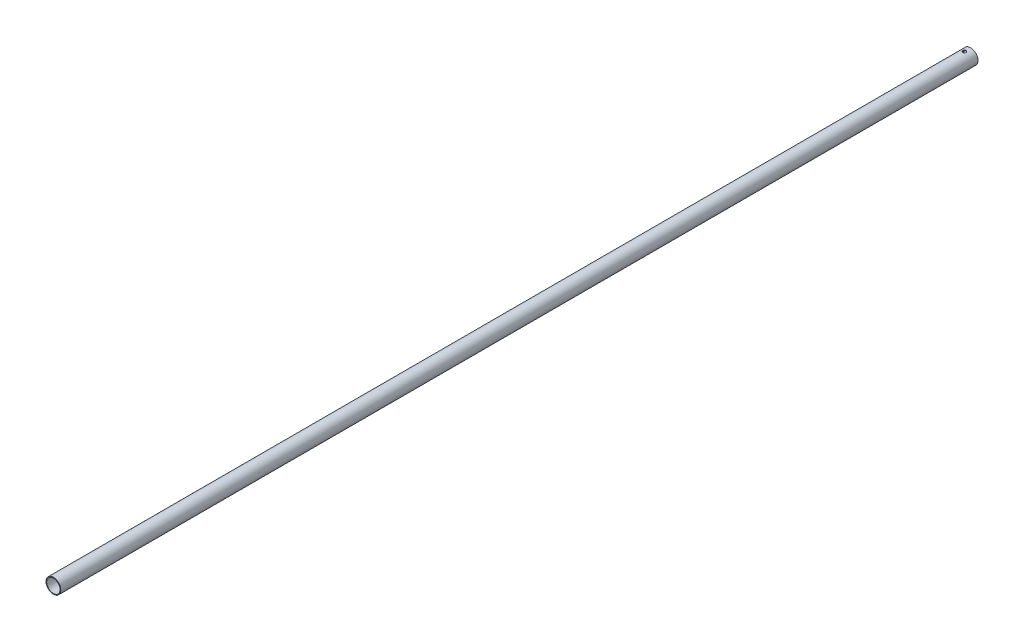
ISO-10303-21;
HEADER;
FILE_DESCRIPTION(('STEP AP214'),'2;1');
FILE_NAME('part.step','',(''),(''),'','','');
FILE_SCHEMA(('AUTOMOTIVE_DESIGN { 1 0 10303 214 1 1 1 1 }'));
ENDSEC;
DATA;
#1=APPLICATION_CONTEXT('core data for automotive mechanical design processes');
#2=APPLICATION_PROTOCOL_DEFINITION('international standard','automotive_design',2000,#1);
#3=PRODUCT_CONTEXT('',#1,'mechanical');
#4=PRODUCT('Part','Part','',(#3));
#5=PRODUCT_RELATED_PRODUCT_CATEGORY('part','',(#4));
#6=PRODUCT_DEFINITION_FORMATION('','',#4);
#7=PRODUCT_DEFINITION_CONTEXT('part definition',#1,'design');
#8=PRODUCT_DEFINITION('design','',#6,#7);
#9=PRODUCT_DEFINITION_SHAPE('','',#8);
#10=(LENGTH_UNIT() NAMED_UNIT(*) SI_UNIT(.MILLI.,.METRE.));
#11=(NAMED_UNIT(*) PLANE_ANGLE_UNIT() SI_UNIT($,.RADIAN.));
#12=(NAMED_UNIT(*) SI_UNIT($,.STERADIAN.) SOLID_ANGLE_UNIT());
#13=UNCERTAINTY_MEASURE_WITH_UNIT(LENGTH_MEASURE(1.E-05),#10,'distance_accuracy_value','');
#14=(GEOMETRIC_REPRESENTATION_CONTEXT(3) GLOBAL_UNCERTAINTY_ASSIGNED_CONTEXT((#13)) GLOBAL_UNIT_ASSIGNED_CONTEXT((#10,
#11,#12)) REPRESENTATION_CONTEXT('',''));
#15=CARTESIAN_POINT('',(0.,0.,0.));
#16=DIRECTION('',(0.,0.,1.));
#17=DIRECTION('',(1.,0.,0.));
#18=AXIS2_PLACEMENT_3D('',#15,#16,#17);
#19=CARTESIAN_POINT('',(0.,0.,1828.8));
#20=DIRECTION('',(0.,0.,1.));
#21=DIRECTION('',(1.,0.,0.));
#22=AXIS2_PLACEMENT_3D('',#19,#20,#21);
#23=PLANE('',#22);
#24=CARTESIAN_POINT('',(0.,0.,1828.8));
#25=DIRECTION('',(0.,0.,1.));
#26=DIRECTION('',(1.,0.,0.));
#27=AXIS2_PLACEMENT_3D('',#24,#25,#26);
#28=CIRCLE('',#27,14.732);
#29=CARTESIAN_POINT('',(14.732,0.,1828.8));
#30=VERTEX_POINT('',#29);
#31=EDGE_CURVE('E49',#30,#30,#28,.T.);
#32=ORIENTED_EDGE('',*,*,#31,.T.);
#33=EDGE_LOOP('',(#32));
#34=FACE_BOUND('',#33,.T.);
#35=CARTESIAN_POINT('',(0.,0.,1828.8));
#36=DIRECTION('',(0.,0.,1.));
#37=DIRECTION('',(1.,0.,0.));
#38=AXIS2_PLACEMENT_3D('',#35,#36,#37);
#39=CIRCLE('',#38,13.3096);
#40=CARTESIAN_POINT('',(13.3096,0.,1828.8));
#41=VERTEX_POINT('',#40);
#42=EDGE_CURVE('E82',#41,#41,#39,.T.);
#43=ORIENTED_EDGE('',*,*,#42,.F.);
#44=EDGE_LOOP('',(#43));
#45=FACE_BOUND('',#44,.T.);
#46=ADVANCED_FACE('F34',(#34,#45),#23,.T.);
#47=CARTESIAN_POINT('',(0.,0.,0.));
#48=DIRECTION('',(0.,0.,1.));
#49=DIRECTION('',(1.,0.,0.));
#50=AXIS2_PLACEMENT_3D('',#47,#48,#49);
#51=PLANE('',#50);
#52=CARTESIAN_POINT('',(0.,0.,0.));
#53=DIRECTION('',(0.,0.,1.));
#54=DIRECTION('',(1.,0.,0.));
#55=AXIS2_PLACEMENT_3D('',#52,#53,#54);
#56=CIRCLE('',#55,14.732);
#57=CARTESIAN_POINT('',(14.732,0.,0.));
#58=VERTEX_POINT('',#57);
#59=EDGE_CURVE('E53',#58,#58,#56,.T.);
#60=ORIENTED_EDGE('',*,*,#59,.F.);
#61=EDGE_LOOP('',(#60));
#62=FACE_BOUND('',#61,.T.);
#63=CARTESIAN_POINT('',(0.,0.,0.));
#64=DIRECTION('',(0.,0.,1.));
#65=DIRECTION('',(1.,0.,0.));
#66=AXIS2_PLACEMENT_3D('',#63,#64,#65);
#67=CIRCLE('',#66,13.3096);
#68=CARTESIAN_POINT('',(13.3096,0.,0.));
#69=VERTEX_POINT('',#68);
#70=EDGE_CURVE('E81',#69,#69,#67,.T.);
#71=ORIENTED_EDGE('',*,*,#70,.T.);
#72=EDGE_LOOP('',(#71));
#73=FACE_BOUND('',#72,.T.);
#74=ADVANCED_FACE('F88',(#62,#73),#51,.F.);
#75=CARTESIAN_POINT('',(0.,0.,1828.8));
#76=DIRECTION('',(0.,0.,-1.));
#77=DIRECTION('',(-1.,0.,0.));
#78=AXIS2_PLACEMENT_3D('',#75,#76,#77);
#79=CYLINDRICAL_SURFACE('',#78,14.732);
#80=CARTESIAN_POINT('',(0.,14.732,9.32179999999983));
#81=CARTESIAN_POINT('',(0.187131447611956,14.7319966001457,9.32180605386422));
#82=CARTESIAN_POINT('',(0.374334152603728,14.7283984719449,9.33740133979259));
#83=CARTESIAN_POINT('',(0.74340655187048,14.7143926969545,9.39929642108672));
#84=CARTESIAN_POINT('',(0.925272607182175,14.703980511571,9.44561668151146));
#85=CARTESIAN_POINT('',(1.2782858791483,14.6775038961328,9.56742230359938));
#86=CARTESIAN_POINT('',(1.44944460488663,14.6614456622814,9.64287570224491));
#87=CARTESIAN_POINT('',(1.77666995391303,14.625402595161,9.82070064260563));
#88=CARTESIAN_POINT('',(1.93273666954159,14.605417785919,9.92307201960888));
#89=CARTESIAN_POINT('',(2.22808819406893,14.5633127111008,10.1537253827067));
#90=CARTESIAN_POINT('',(2.36707054201526,14.5411638090381,10.2823894719563));
#91=CARTESIAN_POINT('',(2.62168345581226,14.4974248200542,10.5611563682776));
#92=CARTESIAN_POINT('',(2.73731177036403,14.475834787182,10.7112612398344));
#93=CARTESIAN_POINT('',(2.94329725387856,14.4353737605774,11.0309214825308));
#94=CARTESIAN_POINT('',(3.03332713324862,14.4165393572966,11.2006928028813));
#95=CARTESIAN_POINT('',(3.18345903659266,14.3841353876776,11.5534593780235));
#96=CARTESIAN_POINT('',(3.24356502308592,14.3705651243149,11.7364528782583));
#97=CARTESIAN_POINT('',(3.33113283599908,14.3505184897756,12.1071732117394));
#98=CARTESIAN_POINT('',(3.35913295020314,14.3439252908497,12.2947664397369));
#99=CARTESIAN_POINT('',(3.38336893369784,14.3382288183229,12.6720946584787));
#100=CARTESIAN_POINT('',(3.37960911052193,14.3391245290169,12.8618293552942));
#101=CARTESIAN_POINT('',(3.34086392025864,14.3481991400425,13.2340135034387));
#102=CARTESIAN_POINT('',(3.3065089932605,14.3562309860178,13.4165327191287));
#103=CARTESIAN_POINT('',(3.20854984189074,14.3784397870969,13.7731458372927));
#104=CARTESIAN_POINT('',(3.14494383155281,14.3926171174189,13.9472392245982));
#105=CARTESIAN_POINT('',(2.98972284628259,14.4256611213651,14.2838044607512));
#106=CARTESIAN_POINT('',(2.89786990869746,14.4445673703978,14.4461625155299));
#107=CARTESIAN_POINT('',(2.68892944508801,14.4849153243439,14.7533919246306));
#108=CARTESIAN_POINT('',(2.57183815869783,14.5063574068666,14.8982606681245));
#109=CARTESIAN_POINT('',(2.3124307323858,14.5499882192732,15.1700235633726));
#110=CARTESIAN_POINT('',(2.16957978037689,14.5721825627183,15.2964068654781));
#111=CARTESIAN_POINT('',(1.86445410983722,14.6143531443339,15.5235111719661));
#112=CARTESIAN_POINT('',(1.7021789685437,14.6343293342085,15.6242316176533));
#113=CARTESIAN_POINT('',(1.36215374790074,14.6698881267572,15.7972969385889));
#114=CARTESIAN_POINT('',(1.1843657152706,14.6854595347365,15.869569693503));
#115=CARTESIAN_POINT('',(0.818730701060208,14.710371815422,15.9830689691913));
#116=CARTESIAN_POINT('',(0.630885335955561,14.719713686149,16.0243004631565));
#117=CARTESIAN_POINT('',(0.254845122038752,14.7309704241799,16.0737917810848));
#118=CARTESIAN_POINT('',(0.0667465926267801,14.7330422904383,16.0827487049661));
#119=CARTESIAN_POINT('',(-0.308259557960982,14.7299678661712,16.0693333774968));
#120=CARTESIAN_POINT('',(-0.495167267322549,14.7248221165348,16.0469634737824));
#121=CARTESIAN_POINT('',(-0.860139860318962,14.7079902344294,15.9721065927819));
#122=CARTESIAN_POINT('',(-1.03828475722023,14.6963845829445,15.9199900164671));
#123=CARTESIAN_POINT('',(-1.38330138843616,14.6679341823493,15.7875341809285));
#124=CARTESIAN_POINT('',(-1.55017209778978,14.651088957676,15.7071923597915));
#125=CARTESIAN_POINT('',(-1.87075093692221,14.6136438889812,15.5191473753149));
#126=CARTESIAN_POINT('',(-2.02421602130011,14.5929900833801,15.4110408592847));
#127=CARTESIAN_POINT('',(-2.3110762731522,14.5503202423161,15.1710611933966));
#128=CARTESIAN_POINT('',(-2.44446855202962,14.5283040114342,15.0391846288766));
#129=CARTESIAN_POINT('',(-2.69019126896926,14.4848408073507,14.7521959890129));
#130=CARTESIAN_POINT('',(-2.80203676703047,14.4634145963205,14.5966649487097));
#131=CARTESIAN_POINT('',(-2.99802691636467,14.4240663823163,14.2686203539915));
#132=CARTESIAN_POINT('',(-3.08217279664048,14.4061442238855,14.0961075534805));
#133=CARTESIAN_POINT('',(-3.21978182721179,14.3760145501504,13.7399364161649));
#134=CARTESIAN_POINT('',(-3.27342273793599,14.3637740050762,13.5563496929139));
#135=CARTESIAN_POINT('',(-3.34900594314382,14.3463415355122,13.1824480248074));
#136=CARTESIAN_POINT('',(-3.37095389252946,14.3411483535876,12.9921342864475));
#137=CARTESIAN_POINT('',(-3.382269202787,14.3384833423039,12.6150841971379));
#138=CARTESIAN_POINT('',(-3.37240728776097,14.3408288523656,12.4283718624401));
#139=CARTESIAN_POINT('',(-3.32211909851957,14.3525608492553,12.0593466988277));
#140=CARTESIAN_POINT('',(-3.28169326113024,14.3619472354536,11.8770338070736));
#141=CARTESIAN_POINT('',(-3.17181349558821,14.3866100650401,11.5226682050254));
#142=CARTESIAN_POINT('',(-3.10248228756408,14.4018615865159,11.3505755915067));
#143=CARTESIAN_POINT('',(-2.93686157962824,14.4365437383777,11.0203541524321));
#144=CARTESIAN_POINT('',(-2.84056895671188,14.4559748528353,10.8622269473153));
#145=CARTESIAN_POINT('',(-2.62124813718453,14.4973644101571,10.560649516865));
#146=CARTESIAN_POINT('',(-2.49767526985933,14.5193692793152,10.4176016983001));
#147=CARTESIAN_POINT('',(-2.22839211689635,14.5631268831364,10.1540209326553));
#148=CARTESIAN_POINT('',(-2.08267668691363,14.5848795579402,10.0334932321833));
#149=CARTESIAN_POINT('',(-1.77068379206408,14.6260586910409,9.81668140400447));
#150=CARTESIAN_POINT('',(-1.60413764725286,14.6454466341934,9.72077613267112));
#151=CARTESIAN_POINT('',(-1.25687158331251,14.679319731042,9.55847495718051));
#152=CARTESIAN_POINT('',(-1.07616313751671,14.6938088039145,9.49205545054899));
#153=CARTESIAN_POINT('',(-0.746188060283068,14.713808009638,9.401816242836));
#154=CARTESIAN_POINT('',(-0.598643048765121,14.7205862935473,9.37186978491507));
#155=CARTESIAN_POINT('',(-0.300747267464762,14.7296835364517,9.33185975912476));
#156=CARTESIAN_POINT('',(-0.15039664722894,14.7320027324466,9.32179513453805));
#157=CARTESIAN_POINT('',(0.,14.732,9.32179999999983));
#158=B_SPLINE_CURVE_WITH_KNOTS('',3,(#80,#81,#82,#83,#84,#85,#86,#87,#88,#89,#90,#91,#92,#93,
#94,#95,#96,#97,#98,#99,#100,#101,#102,#103,#104,#105,#106,#107,#108,#109,#110,#111,#112,#113,
#114,#115,#116,#117,#118,#119,#120,#121,#122,#123,#124,#125,#126,#127,#128,#129,#130,#131,#132,
#133,#134,#135,#136,#137,#138,#139,#140,#141,#142,#143,#144,#145,#146,#147,#148,#149,#150,#151,
#152,#153,#154,#155,#156,#157),.UNSPECIFIED.,.T.,.F.,(4,2,2,2,2,2,2,2,2,2,2,2,2,2,2,2,2,2,2,2,2,
2,2,2,2,2,2,2,2,2,2,2,2,2,2,2,2,2,4),(0.,0.560843630008992,1.12206119812677,1.68266477583236,
2.24326492326711,2.81267983536493,3.38214961216036,3.9586028214096,4.53497967645816,
5.10154479461211,5.66803307196556,6.22311168726183,6.77822419816973,7.33814759775088,
7.89815448037143,8.47151192411654,9.04488184911732,9.61969615578617,10.1944183505402,
10.7566500855535,11.318839689108,11.8741771224607,12.4295649750063,12.9935290549488,
13.5575742152423,14.1331209150034,14.7086420749212,15.2807742225907,15.8528042734209,
16.4110796199459,16.9693469876327,17.5252679398519,18.0812533123722,18.6495468598641,
19.2179726404898,19.7946812306918,20.3709273468026,20.8216986423222,21.2724459787505),.UNSPECIFIED.);
#159=CARTESIAN_POINT('',(0.,14.732,9.32179999999983));
#160=VERTEX_POINT('',#159);
#161=EDGE_CURVE('E10',#160,#160,#158,.T.);
#162=ORIENTED_EDGE('',*,*,#161,.T.);
#163=EDGE_LOOP('',(#162));
#164=FACE_BOUND('',#163,.T.);
#165=CARTESIAN_POINT('',(0.,-14.7319999999864,9.32179999999983));
#166=CARTESIAN_POINT('',(-0.187131447612173,-14.7319966001307,9.32180605386422));
#167=CARTESIAN_POINT('',(-0.374334152604161,-14.7283984719409,9.33740133979263));
#168=CARTESIAN_POINT('',(-0.743406551871034,-14.7143926969585,9.39929642108684));
#169=CARTESIAN_POINT('',(-0.925272607182637,-14.7039805115721,9.44561668151159));
#170=CARTESIAN_POINT('',(-1.2782858791487,-14.6775038961317,9.56742230359955));
#171=CARTESIAN_POINT('',(-1.44944460488704,-14.6614456622811,9.6428757022451));
#172=CARTESIAN_POINT('',(-1.77666995391354,-14.6254025951613,9.82070064260594));
#173=CARTESIAN_POINT('',(-1.93273666954217,-14.605417785919,9.92307201960928));
#174=CARTESIAN_POINT('',(-2.22808819406957,-14.5633127111007,10.1537253827073));
#175=CARTESIAN_POINT('',(-2.36707054201588,-14.541163809038,10.2823894719569));
#176=CARTESIAN_POINT('',(-2.62168345581281,-14.4974248200541,10.5611563682783));
#177=CARTESIAN_POINT('',(-2.73731177036453,-14.4758347871819,10.7112612398351));
#178=CARTESIAN_POINT('',(-2.94329725387897,-14.4353737605773,11.0309214825315));
#179=CARTESIAN_POINT('',(-3.033327133249,-14.4165393572966,11.2006928028821));
#180=CARTESIAN_POINT('',(-3.18345903659295,-14.3841353876775,11.5534593780243));
#181=CARTESIAN_POINT('',(-3.24356502308616,-14.3705651243149,11.7364528782591));
#182=CARTESIAN_POINT('',(-3.33113283599923,-14.3505184897756,12.1071732117402));
#183=CARTESIAN_POINT('',(-3.35913295020325,-14.3439252908496,12.2947664397377));
#184=CARTESIAN_POINT('',(-3.38336893369785,-14.3382288183229,12.6720946584795));
#185=CARTESIAN_POINT('',(-3.37960911052189,-14.3391245290169,12.861829355295));
#186=CARTESIAN_POINT('',(-3.34086392025852,-14.3481991400425,13.2340135034395));
#187=CARTESIAN_POINT('',(-3.30650899326033,-14.3562309860178,13.4165327191295));
#188=CARTESIAN_POINT('',(-3.20854984189049,-14.378439787097,13.7731458372934));
#189=CARTESIAN_POINT('',(-3.14494383155251,-14.392617117419,13.947239224599));
#190=CARTESIAN_POINT('',(-2.98972284628221,-14.4256611213652,14.2838044607519));
#191=CARTESIAN_POINT('',(-2.89786990869704,-14.4445673703979,14.4461625155306));
#192=CARTESIAN_POINT('',(-2.68892944508752,-14.484915324344,14.7533919246313));
#193=CARTESIAN_POINT('',(-2.5718381586973,-14.5063574068667,14.8982606681251));
#194=CARTESIAN_POINT('',(-2.3124307323852,-14.5499882192733,15.1700235633731));
#195=CARTESIAN_POINT('',(-2.16957978037625,-14.5721825627184,15.2964068654787));
#196=CARTESIAN_POINT('',(-1.86445410983653,-14.614353144334,15.5235111719665));
#197=CARTESIAN_POINT('',(-1.70217896854298,-14.6343293342086,15.6242316176537));
#198=CARTESIAN_POINT('',(-1.36215374789997,-14.6698881267573,15.7972969385893));
#199=CARTESIAN_POINT('',(-1.18436571526982,-14.6854595347366,15.8695696935033));
#200=CARTESIAN_POINT('',(-0.818730701059401,-14.7103718154221,15.9830689691915));
#201=CARTESIAN_POINT('',(-0.630885335954746,-14.7197136861491,16.0243004631566));
#202=CARTESIAN_POINT('',(-0.254845122037929,-14.7309704241799,16.0737917810848));
#203=CARTESIAN_POINT('',(-0.0667465926259573,-14.7330422904383,16.0827487049661));
#204=CARTESIAN_POINT('',(0.308259557961795,-14.7299678661712,16.0693333774967));
#205=CARTESIAN_POINT('',(0.495167267323354,-14.7248221165348,16.0469634737823));
#206=CARTESIAN_POINT('',(0.860139860319743,-14.7079902344294,15.9721065927817));
#207=CARTESIAN_POINT('',(1.038284757221,-14.6963845829444,15.9199900164668));
#208=CARTESIAN_POINT('',(1.38330138843689,-14.6679341823493,15.7875341809281));
#209=CARTESIAN_POINT('',(1.5501720977905,-14.651088957676,15.7071923597911));
#210=CARTESIAN_POINT('',(1.87075093692289,-14.6136438889811,15.5191473753144));
#211=CARTESIAN_POINT('',(2.02421602130076,-14.59299008338,15.4110408592842));
#212=CARTESIAN_POINT('',(2.3110762731528,-14.550320242316,15.1710611933961));
#213=CARTESIAN_POINT('',(2.44446855203019,-14.5283040114341,15.039184628876));
#214=CARTESIAN_POINT('',(2.69019126896976,-14.4848408073506,14.7521959890122));
#215=CARTESIAN_POINT('',(2.80203676703094,-14.4634145963204,14.596664948709));
#216=CARTESIAN_POINT('',(2.99802691636505,-14.4240663823162,14.2686203539907));
#217=CARTESIAN_POINT('',(3.08217279664083,-14.4061442238854,14.0961075534798));
#218=CARTESIAN_POINT('',(3.21978182721204,-14.3760145501504,13.7399364161641));
#219=CARTESIAN_POINT('',(3.2734227379362,-14.3637740050762,13.5563496929131));
#220=CARTESIAN_POINT('',(3.34900594314393,-14.3463415355122,13.1824480248065));
#221=CARTESIAN_POINT('',(3.37095389252953,-14.3411483535876,12.9921342864466));
#222=CARTESIAN_POINT('',(3.38226920278697,-14.3384833423039,12.6150841971371));
#223=CARTESIAN_POINT('',(3.3724072877609,-14.3408288523656,12.4283718624393));
#224=CARTESIAN_POINT('',(3.32211909851941,-14.3525608492553,12.0593466988269));
#225=CARTESIAN_POINT('',(3.28169326113004,-14.3619472354537,11.8770338070728));
#226=CARTESIAN_POINT('',(3.17181349558792,-14.3866100650402,11.5226682050246));
#227=CARTESIAN_POINT('',(3.10248228756375,-14.401861586516,11.350575591506));
#228=CARTESIAN_POINT('',(2.93686157962783,-14.4365437383778,11.0203541524314));
#229=CARTESIAN_POINT('',(2.84056895671144,-14.4559748528354,10.8622269473147));
#230=CARTESIAN_POINT('',(2.62124813718402,-14.4973644101572,10.5606495168644));
#231=CARTESIAN_POINT('',(2.4976752698588,-14.5193692793153,10.4176016982995));
#232=CARTESIAN_POINT('',(2.22839211689575,-14.5631268831364,10.1540209326548));
#233=CARTESIAN_POINT('',(2.08267668691299,-14.5848795579402,10.0334932321828));
#234=CARTESIAN_POINT('',(1.77068379206332,-14.6260586910411,9.816681404004));
#235=CARTESIAN_POINT('',(1.60413764725203,-14.6454466341938,9.72077613267067));
#236=CARTESIAN_POINT('',(1.25687158331163,-14.6793197310417,9.55847495718016));
#237=CARTESIAN_POINT('',(1.07616313751585,-14.6938088039133,9.49205545054871));
#238=CARTESIAN_POINT('',(0.746188060282481,-14.713808009639,9.40181624283588));
#239=CARTESIAN_POINT('',(0.598643048764779,-14.7205862935507,9.37186978491501));
#240=CARTESIAN_POINT('',(0.300747267464698,-14.7296835364484,9.33185975912476));
#241=CARTESIAN_POINT('',(0.150396647228908,-14.7320027324342,9.32179513453805));
#242=CARTESIAN_POINT('',(0.,-14.7319999999864,9.32179999999983));
#243=B_SPLINE_CURVE_WITH_KNOTS('',3,(#165,#166,#167,#168,#169,#170,#171,#172,#173,#174,#175,
#176,#177,#178,#179,#180,#181,#182,#183,#184,#185,#186,#187,#188,#189,#190,#191,#192,#193,#194,
#195,#196,#197,#198,#199,#200,#201,#202,#203,#204,#205,#206,#207,#208,#209,#210,#211,#212,#213,
#214,#215,#216,#217,#218,#219,#220,#221,#222,#223,#224,#225,#226,#227,#228,#229,#230,#231,#232,
#233,#234,#235,#236,#237,#238,#239,#240,#241,#242),.UNSPECIFIED.,.T.,.F.,(4,2,2,2,2,2,2,2,2,2,2,
2,2,2,2,2,2,2,2,2,2,2,2,2,2,2,2,2,2,2,2,2,2,2,2,2,2,2,4),(0.,0.560843630009313,1.12206119812693,
1.68266477583258,2.24326492326768,2.81267983536556,3.38214961216094,3.95860282141016,
4.53497967645873,5.10154479461267,5.66803307196612,6.22311168726238,6.77822419817028,
7.33814759775144,7.898154480372,8.47151192411711,9.0448818491179,9.61969615578674,
10.1944183505408,10.7566500855541,11.3188396891086,11.8741771224613,12.4295649750069,
12.9935290549493,13.5575742152429,14.1331209150039,14.7086420749218,15.2807742225913,
15.8528042734214,16.4110796199465,16.9693469876332,17.5252679398525,18.0812533123727,
18.6495468598646,19.2179726404903,19.7946812306925,20.3709273468032,20.8216986423221,
21.27244597875),.UNSPECIFIED.);
#244=CARTESIAN_POINT('',(0.,-14.7319999999864,9.32179999999983));
#245=VERTEX_POINT('',#244);
#246=EDGE_CURVE('E45',#245,#245,#243,.T.);
#247=ORIENTED_EDGE('',*,*,#246,.T.);
#248=EDGE_LOOP('',(#247));
#249=FACE_BOUND('',#248,.T.);
#250=ORIENTED_EDGE('',*,*,#31,.F.);
#251=EDGE_LOOP('',(#250));
#252=FACE_BOUND('',#251,.T.);
#253=ORIENTED_EDGE('',*,*,#59,.T.);
#254=EDGE_LOOP('',(#253));
#255=FACE_BOUND('',#254,.T.);
#256=ADVANCED_FACE('F36',(#164,#249,#252,#255),#79,.T.);
#257=CARTESIAN_POINT('',(0.,0.,1828.8));
#258=DIRECTION('',(0.,0.,-1.));
#259=DIRECTION('',(-1.,0.,0.));
#260=AXIS2_PLACEMENT_3D('',#257,#258,#259);
#261=CYLINDRICAL_SURFACE('',#260,13.3096);
#262=CARTESIAN_POINT('',(0.,13.3096,9.32179999999983));
#263=CARTESIAN_POINT('',(0.186554652962986,13.3095969109228,9.32180506427518));
#264=CARTESIAN_POINT('',(0.37316533638762,13.3056387503281,9.33730513504318));
#265=CARTESIAN_POINT('',(0.741032277003986,13.2902325907197,9.39879925689162));
#266=CARTESIAN_POINT('',(0.922285545424134,13.2787804904748,9.44481000582802));
#267=CARTESIAN_POINT('',(1.27407272645917,13.2496536695332,9.56574938071836));
#268=CARTESIAN_POINT('',(1.44461943097135,13.2319865477845,9.64064270340335));
#269=CARTESIAN_POINT('',(1.77072916191042,13.1923079947584,9.81709557336344));
#270=CARTESIAN_POINT('',(1.92629157036932,13.1702963844239,9.91865621978375));
#271=CARTESIAN_POINT('',(2.22131147855702,13.123794331151,10.147832532983));
#272=CARTESIAN_POINT('',(2.3604064239225,13.0992647065274,10.2759069880218));
#273=CARTESIAN_POINT('',(2.61539104407132,13.0507495996773,10.5534934321833));
#274=CARTESIAN_POINT('',(2.7312780194283,13.0267641810373,10.7030079116277));
#275=CARTESIAN_POINT('',(2.93827618766256,12.9816569072081,11.0220629524792));
#276=CARTESIAN_POINT('',(3.02897923918766,12.9605847262485,11.1918759725819));
#277=CARTESIAN_POINT('',(3.18040921321818,12.9242622644693,11.5449612437461));
#278=CARTESIAN_POINT('',(3.24114109068739,12.9090110214018,11.7282312642789));
#279=CARTESIAN_POINT('',(3.32966292928755,12.8864603488888,12.0990350318006));
#280=CARTESIAN_POINT('',(3.35810600561099,12.8790035157981,12.2864030633535));
#281=CARTESIAN_POINT('',(3.38327761840556,12.8724149979296,12.6633883206009));
#282=CARTESIAN_POINT('',(3.38001148389089,12.8732819142715,12.8530051630132));
#283=CARTESIAN_POINT('',(3.34237790087318,12.8831015874797,13.2240795067148));
#284=CARTESIAN_POINT('',(3.30879137830129,12.8918513050391,13.4056224235155));
#285=CARTESIAN_POINT('',(3.21271728473935,12.916126792158,13.7604086404818));
#286=CARTESIAN_POINT('',(3.15022759847522,12.9316530576535,13.9336513321723));
#287=CARTESIAN_POINT('',(2.99746209552305,12.9679168237261,14.2690002894341));
#288=CARTESIAN_POINT('',(2.90690502819104,12.9887066634958,14.4309725356815));
#289=CARTESIAN_POINT('',(2.70077193224505,13.0331258574421,14.7377009805581));
#290=CARTESIAN_POINT('',(2.58519140207062,13.0567557221802,14.882454074303));
#291=CARTESIAN_POINT('',(2.32825884587872,13.1050451991495,15.15510743275));
#292=CARTESIAN_POINT('',(2.18624852681347,13.1297146514802,15.2823864178681));
#293=CARTESIAN_POINT('',(1.88260203987316,13.1766774179335,15.5114430219632));
#294=CARTESIAN_POINT('',(1.72096523588841,13.1989706549971,15.6132198140665));
#295=CARTESIAN_POINT('',(1.38175070360576,13.2387857275834,15.7886211673993));
#296=CARTESIAN_POINT('',(1.20411726348216,13.2562899571325,15.8621422416022));
#297=CARTESIAN_POINT('',(0.838468380374663,13.2844269237831,15.9781050249451));
#298=CARTESIAN_POINT('',(0.650454994155326,13.2950610169211,16.0205528675804));
#299=CARTESIAN_POINT('',(0.274692882533026,13.3080578792961,16.0722094714894));
#300=CARTESIAN_POINT('',(0.0870675282143573,13.3106310568203,16.0822639763967));
#301=CARTESIAN_POINT('',(-0.287185694745769,13.3078167071077,16.0711717181669));
#302=CARTESIAN_POINT('',(-0.473813654510617,13.3024299200288,16.0500278560123));
#303=CARTESIAN_POINT('',(-0.837817665927995,13.284435989163,15.9778354591342));
#304=CARTESIAN_POINT('',(-1.01529172438224,13.2719408711519,15.9272506289178));
#305=CARTESIAN_POINT('',(-1.35922417805681,13.2411404827736,15.7981438402908));
#306=CARTESIAN_POINT('',(-1.52568143929171,13.2228346154125,15.7196190112368));
#307=CARTESIAN_POINT('',(-1.84620254911101,13.1819417790299,15.5352379889173));
#308=CARTESIAN_POINT('',(-1.99998627558639,13.1592830703432,15.4289111386913));
#309=CARTESIAN_POINT('',(-2.28782794464276,13.1123072483171,15.1925436563825));
#310=CARTESIAN_POINT('',(-2.4218823649277,13.0879898399794,15.0624987991536));
#311=CARTESIAN_POINT('',(-2.66996313138391,13.0396761431003,14.7784551846477));
#312=CARTESIAN_POINT('',(-2.78339538829273,13.0157036352544,14.6239326161434));
#313=CARTESIAN_POINT('',(-2.98272186504876,12.9714797534345,14.2975490012059));
#314=CARTESIAN_POINT('',(-3.06861729702366,12.951228215686,14.1256887183895));
#315=CARTESIAN_POINT('',(-3.20978913734648,12.9169650155754,13.7704192581572));
#316=CARTESIAN_POINT('',(-3.26524663307016,12.9029165486771,13.5870857752571));
#317=CARTESIAN_POINT('',(-3.34443597580053,12.8826201809599,13.2132844536662));
#318=CARTESIAN_POINT('',(-3.3681750173691,12.8763705111942,13.0228182429416));
#319=CARTESIAN_POINT('',(-3.38286901331672,12.8725171097274,12.6462115918051));
#320=CARTESIAN_POINT('',(-3.37477464777319,12.874662651686,12.4601102247462));
#321=CARTESIAN_POINT('',(-3.32821397897427,12.8867765959605,12.0920192487436));
#322=CARTESIAN_POINT('',(-3.28974832287096,12.8967448315903,11.9100295522733));
#323=CARTESIAN_POINT('',(-3.1840635233641,12.923239083001,11.5563980084024));
#324=CARTESIAN_POINT('',(-3.11702787328046,12.9397232017683,11.3846979670713));
#325=CARTESIAN_POINT('',(-2.95625039630482,12.9773966174536,11.054857467728));
#326=CARTESIAN_POINT('',(-2.86250475342327,12.9985865865892,10.8967189514198));
#327=CARTESIAN_POINT('',(-2.64801020321307,13.0439947024499,10.5939089807236));
#328=CARTESIAN_POINT('',(-2.52660406678114,13.0682788600394,10.449712897488));
#329=CARTESIAN_POINT('',(-2.26150868943288,13.1167509252733,10.1834309900639));
#330=CARTESIAN_POINT('',(-2.11781413891375,13.1409388085712,10.0613504493584));
#331=CARTESIAN_POINT('',(-1.80895577724954,13.1870366928881,9.84051973726624));
#332=CARTESIAN_POINT('',(-1.64343869987078,13.2088952351058,9.74225207517397));
#333=CARTESIAN_POINT('',(-1.2976918965115,13.2473244422275,9.57509292571126));
#334=CARTESIAN_POINT('',(-1.11747257547268,13.2638988067239,9.50618087428918));
#335=CARTESIAN_POINT('',(-0.78137484603621,13.2875099960353,9.40964282505157));
#336=CARTESIAN_POINT('',(-0.627064863007049,13.2957360818809,9.37677413274459));
#337=CARTESIAN_POINT('',(-0.315183076251307,13.3067821722657,9.33285145458799));
#338=CARTESIAN_POINT('',(-0.157611534811808,13.3096026098207,9.3217957214241));
#339=CARTESIAN_POINT('',(0.,13.3096,9.32179999999983));
#340=B_SPLINE_CURVE_WITH_KNOTS('',3,(#262,#263,#264,#265,#266,#267,#268,#269,#270,#271,#272,
#273,#274,#275,#276,#277,#278,#279,#280,#281,#282,#283,#284,#285,#286,#287,#288,#289,#290,#291,
#292,#293,#294,#295,#296,#297,#298,#299,#300,#301,#302,#303,#304,#305,#306,#307,#308,#309,#310,
#311,#312,#313,#314,#315,#316,#317,#318,#319,#320,#321,#322,#323,#324,#325,#326,#327,#328,#329,
#330,#331,#332,#333,#334,#335,#336,#337,#338,#339),.UNSPECIFIED.,.T.,.F.,(4,2,2,2,2,2,2,2,2,2,2,
2,2,2,2,2,2,2,2,2,2,2,2,2,2,2,2,2,2,2,2,2,2,2,2,2,2,2,4),(0.,0.559086278806051,1.1184787866414,
1.67718970319196,2.23592365170692,2.8052837730679,3.37471008092363,3.95288768335552,
4.53096966692348,5.09713777006698,5.66321072528513,6.21510738218008,6.76704443594863,
7.32470150201794,7.88245897049595,8.45662962699911,9.03081889779087,9.60709154801935,
10.1832504180209,10.7442392778874,11.3051759774487,11.8575080668609,12.4098969210059,
12.9723220252578,13.5348474184318,14.111637678425,14.6884025455316,15.2616977496149,
15.8348628935004,16.3910427985697,16.9472108528662,17.4998594576539,18.052587057584,
18.6201497278497,19.1878478125856,19.7662338731313,20.344214096495,20.8165984869331,
21.288945035761),.UNSPECIFIED.);
#341=CARTESIAN_POINT('',(0.,13.3096,9.32179999999983));
#342=VERTEX_POINT('',#341);
#343=EDGE_CURVE('E76',#342,#342,#340,.T.);
#344=ORIENTED_EDGE('',*,*,#343,.F.);
#345=EDGE_LOOP('',(#344));
#346=FACE_BOUND('',#345,.T.);
#347=CARTESIAN_POINT('',(0.,-13.3096,9.32179999999983));
#348=CARTESIAN_POINT('',(-0.18655465296299,-13.3095969109228,9.32180506427518));
#349=CARTESIAN_POINT('',(-0.373165336387623,-13.3056387503281,9.33730513504318));
#350=CARTESIAN_POINT('',(-0.741032277003989,-13.2902325907197,9.39879925689162));
#351=CARTESIAN_POINT('',(-0.922285545424138,-13.2787804904748,9.44481000582802));
#352=CARTESIAN_POINT('',(-1.27407272645917,-13.2496536695332,9.56574938071836));
#353=CARTESIAN_POINT('',(-1.44461943097135,-13.2319865477845,9.64064270340335));
#354=CARTESIAN_POINT('',(-1.77072916191043,-13.1923079947584,9.81709557336344));
#355=CARTESIAN_POINT('',(-1.92629157036933,-13.1702963844239,9.91865621978375));
#356=CARTESIAN_POINT('',(-2.22131147855702,-13.123794331151,10.147832532983));
#357=CARTESIAN_POINT('',(-2.36040642392251,-13.0992647065274,10.2759069880218));
#358=CARTESIAN_POINT('',(-2.61539104407132,-13.0507495996773,10.5534934321833));
#359=CARTESIAN_POINT('',(-2.7312780194283,-13.0267641810373,10.7030079116277));
#360=CARTESIAN_POINT('',(-2.93827618766257,-12.9816569072081,11.0220629524792));
#361=CARTESIAN_POINT('',(-3.02897923918766,-12.9605847262485,11.1918759725819));
#362=CARTESIAN_POINT('',(-3.18040921321818,-12.9242622644693,11.5449612437461));
#363=CARTESIAN_POINT('',(-3.24114109068739,-12.9090110214018,11.7282312642789));
#364=CARTESIAN_POINT('',(-3.32966292928755,-12.8864603488888,12.0990350318006));
#365=CARTESIAN_POINT('',(-3.35810600561099,-12.8790035157981,12.2864030633535));
#366=CARTESIAN_POINT('',(-3.38327761840556,-12.8724149979296,12.6633883206009));
#367=CARTESIAN_POINT('',(-3.38001148389089,-12.8732819142715,12.8530051630132));
#368=CARTESIAN_POINT('',(-3.34237790087318,-12.8831015874797,13.2240795067148));
#369=CARTESIAN_POINT('',(-3.30879137830129,-12.8918513050391,13.4056224235155));
#370=CARTESIAN_POINT('',(-3.21271728473935,-12.916126792158,13.7604086404818));
#371=CARTESIAN_POINT('',(-3.15022759847523,-12.9316530576535,13.9336513321723));
#372=CARTESIAN_POINT('',(-2.99746209552306,-12.9679168237261,14.2690002894341));
#373=CARTESIAN_POINT('',(-2.90690502819105,-12.9887066634958,14.4309725356815));
#374=CARTESIAN_POINT('',(-2.70077193224506,-13.0331258574421,14.7377009805581));
#375=CARTESIAN_POINT('',(-2.58519140207063,-13.0567557221802,14.882454074303));
#376=CARTESIAN_POINT('',(-2.32825884587872,-13.1050451991495,15.15510743275));
#377=CARTESIAN_POINT('',(-2.18624852681347,-13.1297146514802,15.2823864178681));
#378=CARTESIAN_POINT('',(-1.88260203987316,-13.1766774179335,15.5114430219632));
#379=CARTESIAN_POINT('',(-1.72096523588842,-13.1989706549971,15.6132198140665));
#380=CARTESIAN_POINT('',(-1.38175070360576,-13.2387857275834,15.7886211673993));
#381=CARTESIAN_POINT('',(-1.20411726348217,-13.2562899571325,15.8621422416022));
#382=CARTESIAN_POINT('',(-0.838468380374666,-13.2844269237831,15.9781050249451));
#383=CARTESIAN_POINT('',(-0.650454994155329,-13.2950610169211,16.0205528675804));
#384=CARTESIAN_POINT('',(-0.274692882533029,-13.3080578792961,16.0722094714894));
#385=CARTESIAN_POINT('',(-0.0870675282143606,-13.3106310568203,16.0822639763967));
#386=CARTESIAN_POINT('',(0.287185694745765,-13.3078167071077,16.0711717181669));
#387=CARTESIAN_POINT('',(0.473813654510614,-13.3024299200288,16.0500278560123));
#388=CARTESIAN_POINT('',(0.837817665927992,-13.284435989163,15.9778354591342));
#389=CARTESIAN_POINT('',(1.01529172438223,-13.2719408711519,15.9272506289178));
#390=CARTESIAN_POINT('',(1.3592241780568,-13.2411404827736,15.7981438402908));
#391=CARTESIAN_POINT('',(1.52568143929171,-13.2228346154125,15.7196190112368));
#392=CARTESIAN_POINT('',(1.84620254911101,-13.1819417790299,15.5352379889173));
#393=CARTESIAN_POINT('',(1.99998627558639,-13.1592830703432,15.4289111386913));
#394=CARTESIAN_POINT('',(2.28782794464276,-13.1123072483171,15.1925436563825));
#395=CARTESIAN_POINT('',(2.4218823649277,-13.0879898399794,15.0624987991536));
#396=CARTESIAN_POINT('',(2.66996313138391,-13.0396761431003,14.7784551846477));
#397=CARTESIAN_POINT('',(2.78339538829273,-13.0157036352544,14.6239326161434));
#398=CARTESIAN_POINT('',(2.98272186504876,-12.9714797534345,14.2975490012059));
#399=CARTESIAN_POINT('',(3.06861729702366,-12.951228215686,14.1256887183895));
#400=CARTESIAN_POINT('',(3.20978913734648,-12.9169650155754,13.7704192581572));
#401=CARTESIAN_POINT('',(3.26524663307015,-12.9029165486771,13.5870857752571));
#402=CARTESIAN_POINT('',(3.34443597580053,-12.8826201809599,13.2132844536662));
#403=CARTESIAN_POINT('',(3.3681750173691,-12.8763705111942,13.0228182429416));
#404=CARTESIAN_POINT('',(3.38286901331672,-12.8725171097274,12.6462115918051));
#405=CARTESIAN_POINT('',(3.37477464777318,-12.874662651686,12.4601102247462));
#406=CARTESIAN_POINT('',(3.32821397897427,-12.8867765959605,12.0920192487436));
#407=CARTESIAN_POINT('',(3.28974832287096,-12.8967448315903,11.9100295522733));
#408=CARTESIAN_POINT('',(3.18406352336409,-12.923239083001,11.5563980084024));
#409=CARTESIAN_POINT('',(3.11702787328046,-12.9397232017683,11.3846979670713));
#410=CARTESIAN_POINT('',(2.95625039630482,-12.9773966174536,11.054857467728));
#411=CARTESIAN_POINT('',(2.86250475342326,-12.9985865865892,10.8967189514198));
#412=CARTESIAN_POINT('',(2.64801020321307,-13.0439947024499,10.5939089807236));
#413=CARTESIAN_POINT('',(2.52660406678114,-13.0682788600394,10.449712897488));
#414=CARTESIAN_POINT('',(2.26150868943288,-13.1167509252733,10.1834309900639));
#415=CARTESIAN_POINT('',(2.11781413891375,-13.1409388085712,10.0613504493584));
#416=CARTESIAN_POINT('',(1.80895577724954,-13.1870366928881,9.84051973726624));
#417=CARTESIAN_POINT('',(1.64343869987078,-13.2088952351058,9.74225207517397));
#418=CARTESIAN_POINT('',(1.2976918965115,-13.2473244422275,9.57509292571126));
#419=CARTESIAN_POINT('',(1.11747257547268,-13.2638988067239,9.50618087428918));
#420=CARTESIAN_POINT('',(0.781374846036207,-13.2875099960353,9.40964282505157));
#421=CARTESIAN_POINT('',(0.627064863007046,-13.2957360818809,9.37677413274459));
#422=CARTESIAN_POINT('',(0.315183076251304,-13.3067821722657,9.33285145458799));
#423=CARTESIAN_POINT('',(0.157611534811805,-13.3096026098207,9.3217957214241));
#424=CARTESIAN_POINT('',(0.,-13.3096,9.32179999999983));
#425=B_SPLINE_CURVE_WITH_KNOTS('',3,(#347,#348,#349,#350,#351,#352,#353,#354,#355,#356,#357,
#358,#359,#360,#361,#362,#363,#364,#365,#366,#367,#368,#369,#370,#371,#372,#373,#374,#375,#376,
#377,#378,#379,#380,#381,#382,#383,#384,#385,#386,#387,#388,#389,#390,#391,#392,#393,#394,#395,
#396,#397,#398,#399,#400,#401,#402,#403,#404,#405,#406,#407,#408,#409,#410,#411,#412,#413,#414,
#415,#416,#417,#418,#419,#420,#421,#422,#423,#424),.UNSPECIFIED.,.T.,.F.,(4,2,2,2,2,2,2,2,2,2,2,
2,2,2,2,2,2,2,2,2,2,2,2,2,2,2,2,2,2,2,2,2,2,2,2,2,2,2,4),(0.,0.559086278806051,1.1184787866414,
1.67718970319196,2.23592365170692,2.8052837730679,3.37471008092363,3.95288768335552,
4.53096966692348,5.09713777006698,5.66321072528513,6.21510738218008,6.76704443594863,
7.32470150201794,7.88245897049595,8.45662962699911,9.03081889779087,9.60709154801935,
10.1832504180209,10.7442392778874,11.3051759774487,11.8575080668609,12.4098969210059,
12.9723220252578,13.5348474184318,14.111637678425,14.6884025455316,15.2616977496149,
15.8348628935004,16.3910427985697,16.9472108528662,17.4998594576539,18.052587057584,
18.6201497278497,19.1878478125856,19.7662338731313,20.344214096495,20.8165984869331,
21.288945035761),.UNSPECIFIED.);
#426=CARTESIAN_POINT('',(0.,-13.3096,9.32179999999983));
#427=VERTEX_POINT('',#426);
#428=EDGE_CURVE('E72',#427,#427,#425,.T.);
#429=ORIENTED_EDGE('',*,*,#428,.F.);
#430=EDGE_LOOP('',(#429));
#431=FACE_BOUND('',#430,.T.);
#432=ORIENTED_EDGE('',*,*,#42,.T.);
#433=EDGE_LOOP('',(#432));
#434=FACE_BOUND('',#433,.T.);
#435=ORIENTED_EDGE('',*,*,#70,.F.);
#436=EDGE_LOOP('',(#435));
#437=FACE_BOUND('',#436,.T.);
#438=ADVANCED_FACE('F64',(#346,#431,#434,#437),#261,.F.);
#439=CARTESIAN_POINT('',(0.,-14.7319999999864,12.6999999999998));
#440=DIRECTION('',(0.,-1.,0.));
#441=DIRECTION('',(0.,0.,-1.));
#442=AXIS2_PLACEMENT_3D('',#439,#440,#441);
#443=CYLINDRICAL_SURFACE('',#442,3.37819999999999);
#444=ORIENTED_EDGE('',*,*,#428,.T.);
#445=EDGE_LOOP('',(#444));
#446=FACE_BOUND('',#445,.T.);
#447=ORIENTED_EDGE('',*,*,#246,.F.);
#448=EDGE_LOOP('',(#447));
#449=FACE_BOUND('',#448,.T.);
#450=ADVANCED_FACE('F62',(#446,#449),#443,.F.);
#451=ORIENTED_EDGE('',*,*,#343,.T.);
#452=EDGE_LOOP('',(#451));
#453=FACE_BOUND('',#452,.T.);
#454=ORIENTED_EDGE('',*,*,#161,.F.);
#455=EDGE_LOOP('',(#454));
#456=FACE_BOUND('',#455,.T.);
#457=ADVANCED_FACE('F58',(#453,#456),#443,.F.);
#458=CLOSED_SHELL('',(#46,#74,#256,#438,#450,#457));
#459=MANIFOLD_SOLID_BREP('B2',#458);
#460=ADVANCED_BREP_SHAPE_REPRESENTATION('',(#18,#459),#14);
#461=SHAPE_DEFINITION_REPRESENTATION(#9,#460);
ENDSEC;
END-ISO-10303-21;
